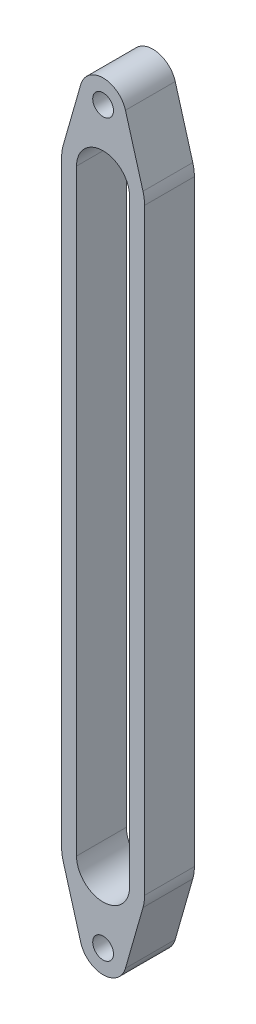
ISO-10303-21;
HEADER;
FILE_DESCRIPTION(('STEP AP214'),'2;1');
FILE_NAME('part.step','',(''),(''),'','','');
FILE_SCHEMA(('AUTOMOTIVE_DESIGN { 1 0 10303 214 1 1 1 1 }'));
ENDSEC;
DATA;
#1=APPLICATION_CONTEXT('core data for automotive mechanical design processes');
#2=APPLICATION_PROTOCOL_DEFINITION('international standard','automotive_design',2000,#1);
#3=PRODUCT_CONTEXT('',#1,'mechanical');
#4=PRODUCT('Part','Part','',(#3));
#5=PRODUCT_RELATED_PRODUCT_CATEGORY('part','',(#4));
#6=PRODUCT_DEFINITION_FORMATION('','',#4);
#7=PRODUCT_DEFINITION_CONTEXT('part definition',#1,'design');
#8=PRODUCT_DEFINITION('design','',#6,#7);
#9=PRODUCT_DEFINITION_SHAPE('','',#8);
#10=(LENGTH_UNIT() NAMED_UNIT(*) SI_UNIT(.MILLI.,.METRE.));
#11=(NAMED_UNIT(*) PLANE_ANGLE_UNIT() SI_UNIT($,.RADIAN.));
#12=(NAMED_UNIT(*) SI_UNIT($,.STERADIAN.) SOLID_ANGLE_UNIT());
#13=UNCERTAINTY_MEASURE_WITH_UNIT(LENGTH_MEASURE(1.E-05),#10,'distance_accuracy_value','');
#14=(GEOMETRIC_REPRESENTATION_CONTEXT(3) GLOBAL_UNCERTAINTY_ASSIGNED_CONTEXT((#13)) GLOBAL_UNIT_ASSIGNED_CONTEXT((#10,
#11,#12)) REPRESENTATION_CONTEXT('',''));
#15=CARTESIAN_POINT('',(0.,0.,0.));
#16=DIRECTION('',(0.,0.,1.));
#17=DIRECTION('',(1.,0.,0.));
#18=AXIS2_PLACEMENT_3D('',#15,#16,#17);
#19=CARTESIAN_POINT('',(753.020961901222,675.64,-26.9748));
#20=DIRECTION('',(0.,0.,1.));
#21=DIRECTION('',(1.,0.,0.));
#22=AXIS2_PLACEMENT_3D('',#19,#20,#21);
#23=CYLINDRICAL_SURFACE('',#22,31.75);
#24=CARTESIAN_POINT('',(753.020961901222,675.64,11.1252));
#25=DIRECTION('',(0.,0.,1.));
#26=DIRECTION('',(-1.,0.,0.));
#27=AXIS2_PLACEMENT_3D('',#24,#25,#26);
#28=CIRCLE('',#27,31.75);
#29=CARTESIAN_POINT('',(722.495107720913,684.37125,11.1252));
#30=VERTEX_POINT('',#29);
#31=CARTESIAN_POINT('',(721.270961901222,675.64,11.1252));
#32=VERTEX_POINT('',#31);
#33=EDGE_CURVE('E190',#30,#32,#28,.T.);
#34=ORIENTED_EDGE('',*,*,#33,.F.);
#35=DIRECTION('',(0.,0.,1.));
#36=VECTOR('',#35,1.);
#37=CARTESIAN_POINT('',(722.495107720913,684.37125,-26.9748));
#38=LINE('',#37,#36);
#39=CARTESIAN_POINT('',(722.495107720913,684.37125,-26.9748));
#40=VERTEX_POINT('',#39);
#41=EDGE_CURVE('E11',#40,#30,#38,.T.);
#42=ORIENTED_EDGE('',*,*,#41,.F.);
#43=CARTESIAN_POINT('',(753.020961901222,675.64,-26.9748));
#44=DIRECTION('',(0.,0.,1.));
#45=DIRECTION('',(-1.,0.,0.));
#46=AXIS2_PLACEMENT_3D('',#43,#44,#45);
#47=CIRCLE('',#46,31.75);
#48=CARTESIAN_POINT('',(721.270961901222,675.64,-26.9748));
#49=VERTEX_POINT('',#48);
#50=EDGE_CURVE('E193',#40,#49,#47,.T.);
#51=ORIENTED_EDGE('',*,*,#50,.T.);
#52=DIRECTION('',(0.,0.,1.));
#53=VECTOR('',#52,1.);
#54=CARTESIAN_POINT('',(721.270961901222,675.64,-26.9748));
#55=LINE('',#54,#53);
#56=EDGE_CURVE('E36',#49,#32,#55,.T.);
#57=ORIENTED_EDGE('',*,*,#56,.T.);
#58=EDGE_LOOP('',(#34,#42,#51,#57));
#59=FACE_BOUND('',#58,.T.);
#60=ADVANCED_FACE('F33',(#59),#23,.T.);
#61=CARTESIAN_POINT('',(735.926483560249,731.3295,-26.9748));
#62=DIRECTION('',(-0.96144422615147,0.275000000000001,0.));
#63=DIRECTION('',(-0.275000000000001,-0.961444226151471,0.));
#64=AXIS2_PLACEMENT_3D('',#61,#62,#63);
#65=PLANE('',#64);
#66=DIRECTION('',(-0.275000000000001,-0.96144422615147,0.));
#67=VECTOR('',#66,1.);
#68=CARTESIAN_POINT('',(735.926483560249,731.3295,11.1252));
#69=LINE('',#68,#67);
#70=CARTESIAN_POINT('',(735.926483560249,731.3295,11.1252));
#71=VERTEX_POINT('',#70);
#72=EDGE_CURVE('E197',#71,#30,#69,.T.);
#73=ORIENTED_EDGE('',*,*,#72,.F.);
#74=DIRECTION('',(0.,0.,1.));
#75=VECTOR('',#74,1.);
#76=CARTESIAN_POINT('',(735.926483560249,731.3295,-26.9748));
#77=LINE('',#76,#75);
#78=CARTESIAN_POINT('',(735.926483560249,731.3295,-26.9748));
#79=VERTEX_POINT('',#78);
#80=EDGE_CURVE('E41',#79,#71,#77,.T.);
#81=ORIENTED_EDGE('',*,*,#80,.F.);
#82=DIRECTION('',(-0.275000000000001,-0.96144422615147,0.));
#83=VECTOR('',#82,1.);
#84=CARTESIAN_POINT('',(735.926483560249,731.3295,-26.9748));
#85=LINE('',#84,#83);
#86=EDGE_CURVE('E227',#79,#40,#85,.T.);
#87=ORIENTED_EDGE('',*,*,#86,.T.);
#88=ORIENTED_EDGE('',*,*,#41,.T.);
#89=EDGE_LOOP('',(#73,#81,#87,#88));
#90=FACE_BOUND('',#89,.T.);
#91=ADVANCED_FACE('F294',(#90),#65,.T.);
#92=CARTESIAN_POINT('',(753.020961901222,726.44,-26.9748));
#93=DIRECTION('',(0.,0.,1.));
#94=DIRECTION('',(1.,0.,0.));
#95=AXIS2_PLACEMENT_3D('',#92,#93,#94);
#96=CYLINDRICAL_SURFACE('',#95,17.78);
#97=CARTESIAN_POINT('',(753.020961901222,726.44,11.1252));
#98=DIRECTION('',(0.,0.,1.));
#99=DIRECTION('',(1.,0.,0.));
#100=AXIS2_PLACEMENT_3D('',#97,#98,#99);
#101=CIRCLE('',#100,17.78);
#102=CARTESIAN_POINT('',(770.115440242195,731.3295,11.1252));
#103=VERTEX_POINT('',#102);
#104=EDGE_CURVE('E259',#103,#71,#101,.T.);
#105=ORIENTED_EDGE('',*,*,#104,.F.);
#106=DIRECTION('',(0.,0.,1.));
#107=VECTOR('',#106,1.);
#108=CARTESIAN_POINT('',(770.115440242195,731.3295,-26.9748));
#109=LINE('',#108,#107);
#110=CARTESIAN_POINT('',(770.115440242195,731.3295,-26.9748));
#111=VERTEX_POINT('',#110);
#112=EDGE_CURVE('E265',#111,#103,#109,.T.);
#113=ORIENTED_EDGE('',*,*,#112,.F.);
#114=CARTESIAN_POINT('',(753.020961901222,726.44,-26.9748));
#115=DIRECTION('',(0.,0.,1.));
#116=DIRECTION('',(1.,0.,0.));
#117=AXIS2_PLACEMENT_3D('',#114,#115,#116);
#118=CIRCLE('',#117,17.78);
#119=EDGE_CURVE('E224',#111,#79,#118,.T.);
#120=ORIENTED_EDGE('',*,*,#119,.T.);
#121=ORIENTED_EDGE('',*,*,#80,.T.);
#122=EDGE_LOOP('',(#105,#113,#120,#121));
#123=FACE_BOUND('',#122,.T.);
#124=ADVANCED_FACE('F330',(#123),#96,.T.);
#125=CARTESIAN_POINT('',(770.115440242195,731.3295,-26.9748));
#126=DIRECTION('',(0.961444226151471,0.274999999999998,0.));
#127=DIRECTION('',(-0.274999999999998,0.961444226151471,0.));
#128=AXIS2_PLACEMENT_3D('',#125,#126,#127);
#129=PLANE('',#128);
#130=DIRECTION('',(-0.274999999999998,0.961444226151471,0.));
#131=VECTOR('',#130,1.);
#132=CARTESIAN_POINT('',(770.115440242195,731.3295,11.1252));
#133=LINE('',#132,#131);
#134=CARTESIAN_POINT('',(783.546816081531,684.37125,11.1252));
#135=VERTEX_POINT('',#134);
#136=EDGE_CURVE('E256',#135,#103,#133,.T.);
#137=ORIENTED_EDGE('',*,*,#136,.F.);
#138=DIRECTION('',(0.,0.,1.));
#139=VECTOR('',#138,1.);
#140=CARTESIAN_POINT('',(783.546816081531,684.37125,-26.9748));
#141=LINE('',#140,#139);
#142=CARTESIAN_POINT('',(783.546816081531,684.37125,-26.9748));
#143=VERTEX_POINT('',#142);
#144=EDGE_CURVE('E267',#143,#135,#141,.T.);
#145=ORIENTED_EDGE('',*,*,#144,.F.);
#146=DIRECTION('',(-0.274999999999998,0.961444226151471,0.));
#147=VECTOR('',#146,1.);
#148=CARTESIAN_POINT('',(770.115440242195,731.3295,-26.9748));
#149=LINE('',#148,#147);
#150=EDGE_CURVE('E221',#143,#111,#149,.T.);
#151=ORIENTED_EDGE('',*,*,#150,.T.);
#152=ORIENTED_EDGE('',*,*,#112,.T.);
#153=EDGE_LOOP('',(#137,#145,#151,#152));
#154=FACE_BOUND('',#153,.T.);
#155=ADVANCED_FACE('F327',(#154),#129,.T.);
#156=CARTESIAN_POINT('',(753.020961901222,675.64,-26.9748));
#157=DIRECTION('',(0.,0.,1.));
#158=DIRECTION('',(1.,0.,0.));
#159=AXIS2_PLACEMENT_3D('',#156,#157,#158);
#160=CYLINDRICAL_SURFACE('',#159,31.75);
#161=CARTESIAN_POINT('',(753.020961901222,675.64,11.1252));
#162=DIRECTION('',(0.,0.,1.));
#163=DIRECTION('',(-1.,0.,0.));
#164=AXIS2_PLACEMENT_3D('',#161,#162,#163);
#165=CIRCLE('',#164,31.75);
#166=CARTESIAN_POINT('',(784.770961901222,675.64,11.1252));
#167=VERTEX_POINT('',#166);
#168=EDGE_CURVE('E253',#167,#135,#165,.T.);
#169=ORIENTED_EDGE('',*,*,#168,.F.);
#170=DIRECTION('',(0.,0.,1.));
#171=VECTOR('',#170,1.);
#172=CARTESIAN_POINT('',(784.770961901222,675.64,-26.9748));
#173=LINE('',#172,#171);
#174=CARTESIAN_POINT('',(784.770961901222,675.64,-26.9748));
#175=VERTEX_POINT('',#174);
#176=EDGE_CURVE('E269',#175,#167,#173,.T.);
#177=ORIENTED_EDGE('',*,*,#176,.F.);
#178=CARTESIAN_POINT('',(753.020961901222,675.64,-26.9748));
#179=DIRECTION('',(0.,0.,1.));
#180=DIRECTION('',(-1.,0.,0.));
#181=AXIS2_PLACEMENT_3D('',#178,#179,#180);
#182=CIRCLE('',#181,31.75);
#183=EDGE_CURVE('E218',#175,#143,#182,.T.);
#184=ORIENTED_EDGE('',*,*,#183,.T.);
#185=ORIENTED_EDGE('',*,*,#144,.T.);
#186=EDGE_LOOP('',(#169,#177,#184,#185));
#187=FACE_BOUND('',#186,.T.);
#188=ADVANCED_FACE('F324',(#187),#160,.T.);
#189=CARTESIAN_POINT('',(784.770961901222,675.64,-26.9748));
#190=DIRECTION('',(1.,0.,0.));
#191=DIRECTION('',(0.,0.,-1.));
#192=AXIS2_PLACEMENT_3D('',#189,#190,#191);
#193=PLANE('',#192);
#194=DIRECTION('',(0.,1.,0.));
#195=VECTOR('',#194,1.);
#196=CARTESIAN_POINT('',(784.770961901222,675.64,11.1252));
#197=LINE('',#196,#195);
#198=CARTESIAN_POINT('',(784.770961901222,218.44,11.1252));
#199=VERTEX_POINT('',#198);
#200=EDGE_CURVE('E250',#199,#167,#197,.T.);
#201=ORIENTED_EDGE('',*,*,#200,.F.);
#202=DIRECTION('',(0.,0.,1.));
#203=VECTOR('',#202,1.);
#204=CARTESIAN_POINT('',(784.770961901222,218.44,-26.9748));
#205=LINE('',#204,#203);
#206=CARTESIAN_POINT('',(784.770961901222,218.44,-26.9748));
#207=VERTEX_POINT('',#206);
#208=EDGE_CURVE('E271',#207,#199,#205,.T.);
#209=ORIENTED_EDGE('',*,*,#208,.F.);
#210=DIRECTION('',(0.,1.,0.));
#211=VECTOR('',#210,1.);
#212=CARTESIAN_POINT('',(784.770961901222,675.64,-26.9748));
#213=LINE('',#212,#211);
#214=EDGE_CURVE('E215',#207,#175,#213,.T.);
#215=ORIENTED_EDGE('',*,*,#214,.T.);
#216=ORIENTED_EDGE('',*,*,#176,.T.);
#217=EDGE_LOOP('',(#201,#209,#215,#216));
#218=FACE_BOUND('',#217,.T.);
#219=ADVANCED_FACE('F320',(#218),#193,.T.);
#220=CARTESIAN_POINT('',(753.020961901222,218.44,-26.9748));
#221=DIRECTION('',(0.,0.,1.));
#222=DIRECTION('',(1.,0.,0.));
#223=AXIS2_PLACEMENT_3D('',#220,#221,#222);
#224=CYLINDRICAL_SURFACE('',#223,31.7499999999993);
#225=CARTESIAN_POINT('',(753.020961901222,218.44,11.1252));
#226=DIRECTION('',(0.,0.,1.));
#227=DIRECTION('',(1.,0.,0.));
#228=AXIS2_PLACEMENT_3D('',#225,#226,#227);
#229=CIRCLE('',#228,31.7499999999993);
#230=CARTESIAN_POINT('',(783.546816081531,209.70875,11.1252));
#231=VERTEX_POINT('',#230);
#232=EDGE_CURVE('E247',#231,#199,#229,.T.);
#233=ORIENTED_EDGE('',*,*,#232,.F.);
#234=DIRECTION('',(0.,0.,1.));
#235=VECTOR('',#234,1.);
#236=CARTESIAN_POINT('',(783.546816081531,209.70875,-26.9748));
#237=LINE('',#236,#235);
#238=CARTESIAN_POINT('',(783.546816081531,209.70875,-26.9748));
#239=VERTEX_POINT('',#238);
#240=EDGE_CURVE('E273',#239,#231,#237,.T.);
#241=ORIENTED_EDGE('',*,*,#240,.F.);
#242=CARTESIAN_POINT('',(753.020961901222,218.44,-26.9748));
#243=DIRECTION('',(0.,0.,1.));
#244=DIRECTION('',(1.,0.,0.));
#245=AXIS2_PLACEMENT_3D('',#242,#243,#244);
#246=CIRCLE('',#245,31.7499999999993);
#247=EDGE_CURVE('E212',#239,#207,#246,.T.);
#248=ORIENTED_EDGE('',*,*,#247,.T.);
#249=ORIENTED_EDGE('',*,*,#208,.T.);
#250=EDGE_LOOP('',(#233,#241,#248,#249));
#251=FACE_BOUND('',#250,.T.);
#252=ADVANCED_FACE('F316',(#251),#224,.T.);
#253=CARTESIAN_POINT('',(770.115440242195,162.7505,-26.9748));
#254=DIRECTION('',(0.961444226151471,-0.274999999999999,0.));
#255=DIRECTION('',(0.274999999999999,0.961444226151471,0.));
#256=AXIS2_PLACEMENT_3D('',#253,#254,#255);
#257=PLANE('',#256);
#258=DIRECTION('',(0.274999999999999,0.961444226151471,0.));
#259=VECTOR('',#258,1.);
#260=CARTESIAN_POINT('',(770.115440242195,162.7505,11.1252));
#261=LINE('',#260,#259);
#262=CARTESIAN_POINT('',(770.115440242196,162.7505,11.1252));
#263=VERTEX_POINT('',#262);
#264=EDGE_CURVE('E244',#263,#231,#261,.T.);
#265=ORIENTED_EDGE('',*,*,#264,.F.);
#266=DIRECTION('',(0.,0.,1.));
#267=VECTOR('',#266,1.);
#268=CARTESIAN_POINT('',(770.115440242196,162.7505,-26.9748));
#269=LINE('',#268,#267);
#270=CARTESIAN_POINT('',(770.115440242196,162.7505,-26.9748));
#271=VERTEX_POINT('',#270);
#272=EDGE_CURVE('E275',#271,#263,#269,.T.);
#273=ORIENTED_EDGE('',*,*,#272,.F.);
#274=DIRECTION('',(0.274999999999999,0.961444226151471,0.));
#275=VECTOR('',#274,1.);
#276=CARTESIAN_POINT('',(770.115440242195,162.7505,-26.9748));
#277=LINE('',#276,#275);
#278=EDGE_CURVE('E209',#271,#239,#277,.T.);
#279=ORIENTED_EDGE('',*,*,#278,.T.);
#280=ORIENTED_EDGE('',*,*,#240,.T.);
#281=EDGE_LOOP('',(#265,#273,#279,#280));
#282=FACE_BOUND('',#281,.T.);
#283=ADVANCED_FACE('F312',(#282),#257,.T.);
#284=CARTESIAN_POINT('',(753.020961901222,167.64,-26.9748));
#285=DIRECTION('',(0.,0.,1.));
#286=DIRECTION('',(1.,0.,0.));
#287=AXIS2_PLACEMENT_3D('',#284,#285,#286);
#288=CYLINDRICAL_SURFACE('',#287,17.78);
#289=CARTESIAN_POINT('',(753.020961901222,167.64,11.1252));
#290=DIRECTION('',(0.,0.,1.));
#291=DIRECTION('',(-1.,0.,0.));
#292=AXIS2_PLACEMENT_3D('',#289,#290,#291);
#293=CIRCLE('',#292,17.78);
#294=CARTESIAN_POINT('',(735.926483560249,162.7505,11.1252));
#295=VERTEX_POINT('',#294);
#296=EDGE_CURVE('E241',#295,#263,#293,.T.);
#297=ORIENTED_EDGE('',*,*,#296,.F.);
#298=DIRECTION('',(0.,0.,1.));
#299=VECTOR('',#298,1.);
#300=CARTESIAN_POINT('',(735.926483560249,162.7505,-26.9748));
#301=LINE('',#300,#299);
#302=CARTESIAN_POINT('',(735.926483560249,162.7505,-26.9748));
#303=VERTEX_POINT('',#302);
#304=EDGE_CURVE('E277',#303,#295,#301,.T.);
#305=ORIENTED_EDGE('',*,*,#304,.F.);
#306=CARTESIAN_POINT('',(753.020961901222,167.64,-26.9748));
#307=DIRECTION('',(0.,0.,1.));
#308=DIRECTION('',(-1.,0.,0.));
#309=AXIS2_PLACEMENT_3D('',#306,#307,#308);
#310=CIRCLE('',#309,17.78);
#311=EDGE_CURVE('E206',#303,#271,#310,.T.);
#312=ORIENTED_EDGE('',*,*,#311,.T.);
#313=ORIENTED_EDGE('',*,*,#272,.T.);
#314=EDGE_LOOP('',(#297,#305,#312,#313));
#315=FACE_BOUND('',#314,.T.);
#316=ADVANCED_FACE('F308',(#315),#288,.T.);
#317=CARTESIAN_POINT('',(735.926483560249,162.7505,-26.9748));
#318=DIRECTION('',(-0.96144422615147,-0.275000000000002,0.));
#319=DIRECTION('',(0.275000000000002,-0.96144422615147,0.));
#320=AXIS2_PLACEMENT_3D('',#317,#318,#319);
#321=PLANE('',#320);
#322=DIRECTION('',(0.275000000000001,-0.96144422615147,0.));
#323=VECTOR('',#322,1.);
#324=CARTESIAN_POINT('',(735.926483560249,162.7505,11.1252));
#325=LINE('',#324,#323);
#326=CARTESIAN_POINT('',(722.495107720913,209.70875,11.1252));
#327=VERTEX_POINT('',#326);
#328=EDGE_CURVE('E238',#327,#295,#325,.T.);
#329=ORIENTED_EDGE('',*,*,#328,.F.);
#330=DIRECTION('',(0.,0.,1.));
#331=VECTOR('',#330,1.);
#332=CARTESIAN_POINT('',(722.495107720913,209.70875,-26.9748));
#333=LINE('',#332,#331);
#334=CARTESIAN_POINT('',(722.495107720913,209.70875,-26.9748));
#335=VERTEX_POINT('',#334);
#336=EDGE_CURVE('E279',#335,#327,#333,.T.);
#337=ORIENTED_EDGE('',*,*,#336,.F.);
#338=DIRECTION('',(0.275000000000001,-0.96144422615147,0.));
#339=VECTOR('',#338,1.);
#340=CARTESIAN_POINT('',(735.926483560249,162.7505,-26.9748));
#341=LINE('',#340,#339);
#342=EDGE_CURVE('E203',#335,#303,#341,.T.);
#343=ORIENTED_EDGE('',*,*,#342,.T.);
#344=ORIENTED_EDGE('',*,*,#304,.T.);
#345=EDGE_LOOP('',(#329,#337,#343,#344));
#346=FACE_BOUND('',#345,.T.);
#347=ADVANCED_FACE('F306',(#346),#321,.T.);
#348=CARTESIAN_POINT('',(753.020961901222,218.44,-26.9748));
#349=DIRECTION('',(0.,0.,1.));
#350=DIRECTION('',(1.,0.,0.));
#351=AXIS2_PLACEMENT_3D('',#348,#349,#350);
#352=CYLINDRICAL_SURFACE('',#351,31.7500000000006);
#353=CARTESIAN_POINT('',(753.020961901222,218.44,11.1252));
#354=DIRECTION('',(0.,0.,1.));
#355=DIRECTION('',(1.,0.,0.));
#356=AXIS2_PLACEMENT_3D('',#353,#354,#355);
#357=CIRCLE('',#356,31.7500000000006);
#358=CARTESIAN_POINT('',(721.270961901222,218.44,11.1252));
#359=VERTEX_POINT('',#358);
#360=EDGE_CURVE('E235',#359,#327,#357,.T.);
#361=ORIENTED_EDGE('',*,*,#360,.F.);
#362=DIRECTION('',(0.,0.,1.));
#363=VECTOR('',#362,1.);
#364=CARTESIAN_POINT('',(721.270961901222,218.44,-26.9748));
#365=LINE('',#364,#363);
#366=CARTESIAN_POINT('',(721.270961901222,218.44,-26.9748));
#367=VERTEX_POINT('',#366);
#368=EDGE_CURVE('E280',#367,#359,#365,.T.);
#369=ORIENTED_EDGE('',*,*,#368,.F.);
#370=CARTESIAN_POINT('',(753.020961901222,218.44,-26.9748));
#371=DIRECTION('',(0.,0.,1.));
#372=DIRECTION('',(1.,0.,0.));
#373=AXIS2_PLACEMENT_3D('',#370,#371,#372);
#374=CIRCLE('',#373,31.7500000000006);
#375=EDGE_CURVE('E200',#367,#335,#374,.T.);
#376=ORIENTED_EDGE('',*,*,#375,.T.);
#377=ORIENTED_EDGE('',*,*,#336,.T.);
#378=EDGE_LOOP('',(#361,#369,#376,#377));
#379=FACE_BOUND('',#378,.T.);
#380=ADVANCED_FACE('F302',(#379),#352,.T.);
#381=CARTESIAN_POINT('',(721.270961901222,675.64,-26.9748));
#382=DIRECTION('',(-1.,0.,0.));
#383=DIRECTION('',(0.,0.,1.));
#384=AXIS2_PLACEMENT_3D('',#381,#382,#383);
#385=PLANE('',#384);
#386=DIRECTION('',(0.,-1.,0.));
#387=VECTOR('',#386,1.);
#388=CARTESIAN_POINT('',(721.270961901222,675.64,11.1252));
#389=LINE('',#388,#387);
#390=EDGE_CURVE('E232',#32,#359,#389,.T.);
#391=ORIENTED_EDGE('',*,*,#390,.F.);
#392=ORIENTED_EDGE('',*,*,#56,.F.);
#393=DIRECTION('',(0.,-1.,0.));
#394=VECTOR('',#393,1.);
#395=CARTESIAN_POINT('',(721.270961901222,675.64,-26.9748));
#396=LINE('',#395,#394);
#397=EDGE_CURVE('E196',#49,#367,#396,.T.);
#398=ORIENTED_EDGE('',*,*,#397,.T.);
#399=ORIENTED_EDGE('',*,*,#368,.T.);
#400=EDGE_LOOP('',(#391,#392,#398,#399));
#401=FACE_BOUND('',#400,.T.);
#402=ADVANCED_FACE('F288',(#401),#385,.T.);
#403=CARTESIAN_POINT('',(753.020961901222,675.64,-26.9748));
#404=DIRECTION('',(0.,0.,-1.));
#405=DIRECTION('',(-1.,0.,0.));
#406=AXIS2_PLACEMENT_3D('',#403,#404,#405);
#407=PLANE('',#406);
#408=CARTESIAN_POINT('',(753.020961901222,167.64,-26.9748));
#409=DIRECTION('',(0.,0.,1.));
#410=DIRECTION('',(1.,0.,0.));
#411=AXIS2_PLACEMENT_3D('',#408,#409,#410);
#412=CIRCLE('',#411,7.9375000000001);
#413=CARTESIAN_POINT('',(760.958461901223,167.64,-26.9748));
#414=VERTEX_POINT('',#413);
#415=EDGE_CURVE('E177',#414,#414,#412,.T.);
#416=ORIENTED_EDGE('',*,*,#415,.T.);
#417=EDGE_LOOP('',(#416));
#418=FACE_BOUND('',#417,.T.);
#419=CARTESIAN_POINT('',(753.020961901222,675.64,-26.9748));
#420=DIRECTION('',(0.,0.,1.));
#421=DIRECTION('',(-1.,0.,0.));
#422=AXIS2_PLACEMENT_3D('',#419,#420,#421);
#423=CIRCLE('',#422,20.32);
#424=CARTESIAN_POINT('',(773.340961901222,675.64,-26.9748));
#425=VERTEX_POINT('',#424);
#426=CARTESIAN_POINT('',(732.700961901222,675.64,-26.9748));
#427=VERTEX_POINT('',#426);
#428=EDGE_CURVE('E148',#425,#427,#423,.T.);
#429=ORIENTED_EDGE('',*,*,#428,.T.);
#430=DIRECTION('',(0.,-1.,0.));
#431=VECTOR('',#430,1.);
#432=CARTESIAN_POINT('',(732.700961901222,675.64,-26.9748));
#433=LINE('',#432,#431);
#434=CARTESIAN_POINT('',(732.700961901222,218.44,-26.9748));
#435=VERTEX_POINT('',#434);
#436=EDGE_CURVE('E157',#427,#435,#433,.T.);
#437=ORIENTED_EDGE('',*,*,#436,.T.);
#438=CARTESIAN_POINT('',(753.020961901222,218.44,-26.9748));
#439=DIRECTION('',(0.,0.,1.));
#440=DIRECTION('',(1.,0.,0.));
#441=AXIS2_PLACEMENT_3D('',#438,#439,#440);
#442=CIRCLE('',#441,20.32);
#443=CARTESIAN_POINT('',(773.340961901222,218.44,-26.9748));
#444=VERTEX_POINT('',#443);
#445=EDGE_CURVE('E49',#435,#444,#442,.T.);
#446=ORIENTED_EDGE('',*,*,#445,.T.);
#447=DIRECTION('',(0.,1.,0.));
#448=VECTOR('',#447,1.);
#449=CARTESIAN_POINT('',(773.340961901222,218.44,-26.9748));
#450=LINE('',#449,#448);
#451=EDGE_CURVE('E154',#444,#425,#450,.T.);
#452=ORIENTED_EDGE('',*,*,#451,.T.);
#453=EDGE_LOOP('',(#429,#437,#446,#452));
#454=FACE_BOUND('',#453,.T.);
#455=CARTESIAN_POINT('',(753.020961901222,726.44,-26.9748));
#456=DIRECTION('',(0.,0.,1.));
#457=DIRECTION('',(1.,0.,0.));
#458=AXIS2_PLACEMENT_3D('',#455,#456,#457);
#459=CIRCLE('',#458,7.9375000000001);
#460=CARTESIAN_POINT('',(760.958461901222,726.44,-26.9748));
#461=VERTEX_POINT('',#460);
#462=EDGE_CURVE('E187',#461,#461,#459,.T.);
#463=ORIENTED_EDGE('',*,*,#462,.T.);
#464=EDGE_LOOP('',(#463));
#465=FACE_BOUND('',#464,.T.);
#466=ORIENTED_EDGE('',*,*,#50,.F.);
#467=ORIENTED_EDGE('',*,*,#86,.F.);
#468=ORIENTED_EDGE('',*,*,#119,.F.);
#469=ORIENTED_EDGE('',*,*,#150,.F.);
#470=ORIENTED_EDGE('',*,*,#183,.F.);
#471=ORIENTED_EDGE('',*,*,#214,.F.);
#472=ORIENTED_EDGE('',*,*,#247,.F.);
#473=ORIENTED_EDGE('',*,*,#278,.F.);
#474=ORIENTED_EDGE('',*,*,#311,.F.);
#475=ORIENTED_EDGE('',*,*,#342,.F.);
#476=ORIENTED_EDGE('',*,*,#375,.F.);
#477=ORIENTED_EDGE('',*,*,#397,.F.);
#478=EDGE_LOOP('',(#466,#467,#468,#469,#470,#471,#472,#473,#474,#475,#476,#477));
#479=FACE_BOUND('',#478,.T.);
#480=ADVANCED_FACE('F161',(#418,#454,#465,#479),#407,.T.);
#481=CARTESIAN_POINT('',(753.020961901222,675.64,11.1252));
#482=DIRECTION('',(0.,0.,-1.));
#483=DIRECTION('',(-1.,0.,0.));
#484=AXIS2_PLACEMENT_3D('',#481,#482,#483);
#485=PLANE('',#484);
#486=CARTESIAN_POINT('',(753.020961901222,167.64,11.1252));
#487=DIRECTION('',(0.,0.,1.));
#488=DIRECTION('',(1.,0.,0.));
#489=AXIS2_PLACEMENT_3D('',#486,#487,#488);
#490=CIRCLE('',#489,7.9375000000001);
#491=CARTESIAN_POINT('',(760.958461901223,167.64,11.1252));
#492=VERTEX_POINT('',#491);
#493=EDGE_CURVE('E170',#492,#492,#490,.T.);
#494=ORIENTED_EDGE('',*,*,#493,.F.);
#495=EDGE_LOOP('',(#494));
#496=FACE_BOUND('',#495,.T.);
#497=DIRECTION('',(0.,-1.,0.));
#498=VECTOR('',#497,1.);
#499=CARTESIAN_POINT('',(732.700961901222,675.64,11.1252));
#500=LINE('',#499,#498);
#501=CARTESIAN_POINT('',(732.700961901222,675.64,11.1252));
#502=VERTEX_POINT('',#501);
#503=CARTESIAN_POINT('',(732.700961901222,218.44,11.1252));
#504=VERTEX_POINT('',#503);
#505=EDGE_CURVE('E176',#502,#504,#500,.T.);
#506=ORIENTED_EDGE('',*,*,#505,.F.);
#507=CARTESIAN_POINT('',(753.020961901222,675.64,11.1252));
#508=DIRECTION('',(0.,0.,1.));
#509=DIRECTION('',(-1.,0.,0.));
#510=AXIS2_PLACEMENT_3D('',#507,#508,#509);
#511=CIRCLE('',#510,20.32);
#512=CARTESIAN_POINT('',(773.340961901222,675.64,11.1252));
#513=VERTEX_POINT('',#512);
#514=EDGE_CURVE('E57',#513,#502,#511,.T.);
#515=ORIENTED_EDGE('',*,*,#514,.F.);
#516=DIRECTION('',(0.,1.,0.));
#517=VECTOR('',#516,1.);
#518=CARTESIAN_POINT('',(773.340961901222,218.44,11.1252));
#519=LINE('',#518,#517);
#520=CARTESIAN_POINT('',(773.340961901222,218.44,11.1252));
#521=VERTEX_POINT('',#520);
#522=EDGE_CURVE('E164',#521,#513,#519,.T.);
#523=ORIENTED_EDGE('',*,*,#522,.F.);
#524=CARTESIAN_POINT('',(753.020961901222,218.44,11.1252));
#525=DIRECTION('',(0.,0.,1.));
#526=DIRECTION('',(1.,0.,0.));
#527=AXIS2_PLACEMENT_3D('',#524,#525,#526);
#528=CIRCLE('',#527,20.32);
#529=EDGE_CURVE('E167',#504,#521,#528,.T.);
#530=ORIENTED_EDGE('',*,*,#529,.F.);
#531=EDGE_LOOP('',(#506,#515,#523,#530));
#532=FACE_BOUND('',#531,.T.);
#533=CARTESIAN_POINT('',(753.020961901222,726.44,11.1252));
#534=DIRECTION('',(0.,0.,1.));
#535=DIRECTION('',(1.,0.,0.));
#536=AXIS2_PLACEMENT_3D('',#533,#534,#535);
#537=CIRCLE('',#536,7.9375000000001);
#538=CARTESIAN_POINT('',(760.958461901222,726.44,11.1252));
#539=VERTEX_POINT('',#538);
#540=EDGE_CURVE('E183',#539,#539,#537,.T.);
#541=ORIENTED_EDGE('',*,*,#540,.F.);
#542=EDGE_LOOP('',(#541));
#543=FACE_BOUND('',#542,.T.);
#544=ORIENTED_EDGE('',*,*,#33,.T.);
#545=ORIENTED_EDGE('',*,*,#390,.T.);
#546=ORIENTED_EDGE('',*,*,#360,.T.);
#547=ORIENTED_EDGE('',*,*,#328,.T.);
#548=ORIENTED_EDGE('',*,*,#296,.T.);
#549=ORIENTED_EDGE('',*,*,#264,.T.);
#550=ORIENTED_EDGE('',*,*,#232,.T.);
#551=ORIENTED_EDGE('',*,*,#200,.T.);
#552=ORIENTED_EDGE('',*,*,#168,.T.);
#553=ORIENTED_EDGE('',*,*,#136,.T.);
#554=ORIENTED_EDGE('',*,*,#104,.T.);
#555=ORIENTED_EDGE('',*,*,#72,.T.);
#556=EDGE_LOOP('',(#544,#545,#546,#547,#548,#549,#550,#551,#552,#553,#554,#555));
#557=FACE_BOUND('',#556,.T.);
#558=ADVANCED_FACE('F290',(#496,#532,#543,#557),#485,.F.);
#559=CARTESIAN_POINT('',(753.020961901222,726.44,-26.9748));
#560=DIRECTION('',(0.,0.,1.));
#561=DIRECTION('',(1.,0.,0.));
#562=AXIS2_PLACEMENT_3D('',#559,#560,#561);
#563=CYLINDRICAL_SURFACE('',#562,7.9375000000001);
#564=CARTESIAN_POINT('',(760.958461901222,726.44,-26.9748));
#565=CARTESIAN_POINT('',(760.958461901222,726.44,-26.577925));
#566=CARTESIAN_POINT('',(760.958461901222,726.44,-26.18105));
#567=CARTESIAN_POINT('',(760.958461901222,726.44,-25.3873));
#568=CARTESIAN_POINT('',(760.958461901222,726.44,-24.990425));
#569=CARTESIAN_POINT('',(760.958461901222,726.44,-24.196675));
#570=CARTESIAN_POINT('',(760.958461901222,726.44,-23.7998));
#571=CARTESIAN_POINT('',(760.958461901222,726.44,-23.00605));
#572=CARTESIAN_POINT('',(760.958461901222,726.44,-22.609175));
#573=CARTESIAN_POINT('',(760.958461901222,726.44,-21.815425));
#574=CARTESIAN_POINT('',(760.958461901222,726.44,-21.41855));
#575=CARTESIAN_POINT('',(760.958461901222,726.44,-20.6248));
#576=CARTESIAN_POINT('',(760.958461901222,726.44,-20.227925));
#577=CARTESIAN_POINT('',(760.958461901222,726.44,-19.434175));
#578=CARTESIAN_POINT('',(760.958461901222,726.44,-19.0373));
#579=CARTESIAN_POINT('',(760.958461901222,726.44,-18.24355));
#580=CARTESIAN_POINT('',(760.958461901222,726.44,-17.846675));
#581=CARTESIAN_POINT('',(760.958461901222,726.44,-17.052925));
#582=CARTESIAN_POINT('',(760.958461901222,726.44,-16.65605));
#583=CARTESIAN_POINT('',(760.958461901222,726.44,-15.8623));
#584=CARTESIAN_POINT('',(760.958461901222,726.44,-15.465425));
#585=CARTESIAN_POINT('',(760.958461901222,726.44,-14.671675));
#586=CARTESIAN_POINT('',(760.958461901222,726.44,-14.2748));
#587=CARTESIAN_POINT('',(760.958461901222,726.44,-13.48105));
#588=CARTESIAN_POINT('',(760.958461901222,726.44,-13.084175));
#589=CARTESIAN_POINT('',(760.958461901222,726.44,-12.290425));
#590=CARTESIAN_POINT('',(760.958461901222,726.44,-11.89355));
#591=CARTESIAN_POINT('',(760.958461901222,726.44,-11.0998));
#592=CARTESIAN_POINT('',(760.958461901222,726.44,-10.702925));
#593=CARTESIAN_POINT('',(760.958461901222,726.44,-9.909175));
#594=CARTESIAN_POINT('',(760.958461901222,726.44,-9.5123));
#595=CARTESIAN_POINT('',(760.958461901222,726.44,-8.71855));
#596=CARTESIAN_POINT('',(760.958461901222,726.44,-8.321675));
#597=CARTESIAN_POINT('',(760.958461901222,726.44,-7.527925));
#598=CARTESIAN_POINT('',(760.958461901222,726.44,-7.13105));
#599=CARTESIAN_POINT('',(760.958461901222,726.44,-6.3373));
#600=CARTESIAN_POINT('',(760.958461901222,726.44,-5.940425));
#601=CARTESIAN_POINT('',(760.958461901222,726.44,-5.146675));
#602=CARTESIAN_POINT('',(760.958461901222,726.44,-4.7498));
#603=CARTESIAN_POINT('',(760.958461901222,726.44,-3.95605));
#604=CARTESIAN_POINT('',(760.958461901222,726.44,-3.559175));
#605=CARTESIAN_POINT('',(760.958461901222,726.44,-2.765425));
#606=CARTESIAN_POINT('',(760.958461901222,726.44,-2.36855));
#607=CARTESIAN_POINT('',(760.958461901222,726.44,-1.5748));
#608=CARTESIAN_POINT('',(760.958461901222,726.44,-1.177925));
#609=CARTESIAN_POINT('',(760.958461901222,726.44,-0.384174999999998));
#610=CARTESIAN_POINT('',(760.958461901222,726.44,0.012700000000002));
#611=CARTESIAN_POINT('',(760.958461901222,726.44,0.806450000000003));
#612=CARTESIAN_POINT('',(760.958461901222,726.44,1.203325));
#613=CARTESIAN_POINT('',(760.958461901222,726.44,1.997075));
#614=CARTESIAN_POINT('',(760.958461901222,726.44,2.39395));
#615=CARTESIAN_POINT('',(760.958461901222,726.44,3.1877));
#616=CARTESIAN_POINT('',(760.958461901222,726.44,3.584575));
#617=CARTESIAN_POINT('',(760.958461901222,726.44,4.378325));
#618=CARTESIAN_POINT('',(760.958461901222,726.44,4.7752));
#619=CARTESIAN_POINT('',(760.958461901222,726.44,5.56895));
#620=CARTESIAN_POINT('',(760.958461901222,726.44,5.965825));
#621=CARTESIAN_POINT('',(760.958461901222,726.44,6.759575));
#622=CARTESIAN_POINT('',(760.958461901222,726.44,7.15645));
#623=CARTESIAN_POINT('',(760.958461901222,726.44,7.9502));
#624=CARTESIAN_POINT('',(760.958461901222,726.44,8.347075));
#625=CARTESIAN_POINT('',(760.958461901222,726.44,9.140825));
#626=CARTESIAN_POINT('',(760.958461901222,726.44,9.5377));
#627=CARTESIAN_POINT('',(760.958461901222,726.44,10.33145));
#628=CARTESIAN_POINT('',(760.958461901222,726.44,10.728325));
#629=CARTESIAN_POINT('',(760.958461901222,726.44,11.1252));
#630=B_SPLINE_CURVE_WITH_KNOTS('',3,(#564,#565,#566,#567,#568,#569,#570,#571,#572,#573,#574,
#575,#576,#577,#578,#579,#580,#581,#582,#583,#584,#585,#586,#587,#588,#589,#590,#591,#592,#593,
#594,#595,#596,#597,#598,#599,#600,#601,#602,#603,#604,#605,#606,#607,#608,#609,#610,#611,#612,
#613,#614,#615,#616,#617,#618,#619,#620,#621,#622,#623,#624,#625,#626,#627,#628,#629),
.UNSPECIFIED.,.F.,.F.,(4,2,2,2,2,2,2,2,2,2,2,2,2,2,2,2,2,2,2,2,2,2,2,2,2,2,2,2,2,2,2,2,4),(0.,
1.190625,2.38125,3.571875,4.7625,5.953125,7.14375,8.334375,9.525,10.715625,11.90625,13.096875,
14.2875,15.478125,16.66875,17.859375,19.05,20.240625,21.43125,22.621875,23.8125,25.003125,
26.19375,27.384375,28.575,29.765625,30.95625,32.146875,33.3375,34.528125,35.71875,36.909375,
38.1),.UNSPECIFIED.);
#631=EDGE_CURVE('BSEAM437',#461,#539,#630,.T.);
#632=ORIENTED_EDGE('',*,*,#462,.F.);
#633=ORIENTED_EDGE('',*,*,#540,.T.);
#634=ORIENTED_EDGE('',*,*,#631,.T.);
#635=ORIENTED_EDGE('',*,*,#631,.F.);
#636=EDGE_LOOP('',(#632,#634,#633,#635));
#637=FACE_BOUND('',#636,.T.);
#638=ADVANCED_FACE('F437',(#637),#563,.F.);
#639=CARTESIAN_POINT('',(753.020961901222,675.64,-26.9748));
#640=DIRECTION('',(0.,0.,1.));
#641=DIRECTION('',(1.,0.,0.));
#642=AXIS2_PLACEMENT_3D('',#639,#640,#641);
#643=CYLINDRICAL_SURFACE('',#642,20.32);
#644=ORIENTED_EDGE('',*,*,#514,.T.);
#645=DIRECTION('',(0.,0.,1.));
#646=VECTOR('',#645,1.);
#647=CARTESIAN_POINT('',(732.700961901222,675.64,-26.9748));
#648=LINE('',#647,#646);
#649=EDGE_CURVE('E144',#427,#502,#648,.T.);
#650=ORIENTED_EDGE('',*,*,#649,.F.);
#651=ORIENTED_EDGE('',*,*,#428,.F.);
#652=DIRECTION('',(0.,0.,1.));
#653=VECTOR('',#652,1.);
#654=CARTESIAN_POINT('',(773.340961901222,675.64,-26.9748));
#655=LINE('',#654,#653);
#656=EDGE_CURVE('E181',#425,#513,#655,.T.);
#657=ORIENTED_EDGE('',*,*,#656,.T.);
#658=EDGE_LOOP('',(#644,#650,#651,#657));
#659=FACE_BOUND('',#658,.T.);
#660=ADVANCED_FACE('F146',(#659),#643,.F.);
#661=CARTESIAN_POINT('',(773.340961901222,218.44,-26.9748));
#662=DIRECTION('',(1.,0.,0.));
#663=DIRECTION('',(0.,0.,-1.));
#664=AXIS2_PLACEMENT_3D('',#661,#662,#663);
#665=PLANE('',#664);
#666=ORIENTED_EDGE('',*,*,#522,.T.);
#667=ORIENTED_EDGE('',*,*,#656,.F.);
#668=ORIENTED_EDGE('',*,*,#451,.F.);
#669=DIRECTION('',(0.,0.,1.));
#670=VECTOR('',#669,1.);
#671=CARTESIAN_POINT('',(773.340961901222,218.44,-26.9748));
#672=LINE('',#671,#670);
#673=EDGE_CURVE('E184',#444,#521,#672,.T.);
#674=ORIENTED_EDGE('',*,*,#673,.T.);
#675=EDGE_LOOP('',(#666,#667,#668,#674));
#676=FACE_BOUND('',#675,.T.);
#677=ADVANCED_FACE('F456',(#676),#665,.F.);
#678=CARTESIAN_POINT('',(753.020961901222,218.44,-26.9748));
#679=DIRECTION('',(0.,0.,1.));
#680=DIRECTION('',(1.,0.,0.));
#681=AXIS2_PLACEMENT_3D('',#678,#679,#680);
#682=CYLINDRICAL_SURFACE('',#681,20.32);
#683=ORIENTED_EDGE('',*,*,#529,.T.);
#684=ORIENTED_EDGE('',*,*,#673,.F.);
#685=ORIENTED_EDGE('',*,*,#445,.F.);
#686=DIRECTION('',(0.,0.,1.));
#687=VECTOR('',#686,1.);
#688=CARTESIAN_POINT('',(732.700961901222,218.44,-26.9748));
#689=LINE('',#688,#687);
#690=EDGE_CURVE('E153',#435,#504,#689,.T.);
#691=ORIENTED_EDGE('',*,*,#690,.T.);
#692=EDGE_LOOP('',(#683,#684,#685,#691));
#693=FACE_BOUND('',#692,.T.);
#694=ADVANCED_FACE('F465',(#693),#682,.F.);
#695=CARTESIAN_POINT('',(732.700961901222,675.64,-26.9748));
#696=DIRECTION('',(-1.,0.,0.));
#697=DIRECTION('',(0.,0.,1.));
#698=AXIS2_PLACEMENT_3D('',#695,#696,#697);
#699=PLANE('',#698);
#700=ORIENTED_EDGE('',*,*,#505,.T.);
#701=ORIENTED_EDGE('',*,*,#690,.F.);
#702=ORIENTED_EDGE('',*,*,#436,.F.);
#703=ORIENTED_EDGE('',*,*,#649,.T.);
#704=EDGE_LOOP('',(#700,#701,#702,#703));
#705=FACE_BOUND('',#704,.T.);
#706=ADVANCED_FACE('F158',(#705),#699,.F.);
#707=CARTESIAN_POINT('',(753.020961901222,167.64,-26.9748));
#708=DIRECTION('',(0.,0.,1.));
#709=DIRECTION('',(1.,0.,0.));
#710=AXIS2_PLACEMENT_3D('',#707,#708,#709);
#711=CYLINDRICAL_SURFACE('',#710,7.9375000000001);
#712=CARTESIAN_POINT('',(760.958461901223,167.64,-26.9748));
#713=CARTESIAN_POINT('',(760.958461901223,167.64,-26.577925));
#714=CARTESIAN_POINT('',(760.958461901223,167.64,-26.18105));
#715=CARTESIAN_POINT('',(760.958461901223,167.64,-25.3873));
#716=CARTESIAN_POINT('',(760.958461901223,167.64,-24.990425));
#717=CARTESIAN_POINT('',(760.958461901223,167.64,-24.196675));
#718=CARTESIAN_POINT('',(760.958461901223,167.64,-23.7998));
#719=CARTESIAN_POINT('',(760.958461901223,167.64,-23.00605));
#720=CARTESIAN_POINT('',(760.958461901223,167.64,-22.609175));
#721=CARTESIAN_POINT('',(760.958461901223,167.64,-21.815425));
#722=CARTESIAN_POINT('',(760.958461901223,167.64,-21.41855));
#723=CARTESIAN_POINT('',(760.958461901223,167.64,-20.6248));
#724=CARTESIAN_POINT('',(760.958461901223,167.64,-20.227925));
#725=CARTESIAN_POINT('',(760.958461901223,167.64,-19.434175));
#726=CARTESIAN_POINT('',(760.958461901223,167.64,-19.0373));
#727=CARTESIAN_POINT('',(760.958461901223,167.64,-18.24355));
#728=CARTESIAN_POINT('',(760.958461901223,167.64,-17.846675));
#729=CARTESIAN_POINT('',(760.958461901223,167.64,-17.052925));
#730=CARTESIAN_POINT('',(760.958461901223,167.64,-16.65605));
#731=CARTESIAN_POINT('',(760.958461901223,167.64,-15.8623));
#732=CARTESIAN_POINT('',(760.958461901223,167.64,-15.465425));
#733=CARTESIAN_POINT('',(760.958461901223,167.64,-14.671675));
#734=CARTESIAN_POINT('',(760.958461901223,167.64,-14.2748));
#735=CARTESIAN_POINT('',(760.958461901223,167.64,-13.48105));
#736=CARTESIAN_POINT('',(760.958461901223,167.64,-13.084175));
#737=CARTESIAN_POINT('',(760.958461901223,167.64,-12.290425));
#738=CARTESIAN_POINT('',(760.958461901223,167.64,-11.89355));
#739=CARTESIAN_POINT('',(760.958461901223,167.64,-11.0998));
#740=CARTESIAN_POINT('',(760.958461901223,167.64,-10.702925));
#741=CARTESIAN_POINT('',(760.958461901223,167.64,-9.909175));
#742=CARTESIAN_POINT('',(760.958461901223,167.64,-9.5123));
#743=CARTESIAN_POINT('',(760.958461901223,167.64,-8.71855));
#744=CARTESIAN_POINT('',(760.958461901223,167.64,-8.321675));
#745=CARTESIAN_POINT('',(760.958461901223,167.64,-7.527925));
#746=CARTESIAN_POINT('',(760.958461901223,167.64,-7.13105));
#747=CARTESIAN_POINT('',(760.958461901223,167.64,-6.3373));
#748=CARTESIAN_POINT('',(760.958461901223,167.64,-5.940425));
#749=CARTESIAN_POINT('',(760.958461901223,167.64,-5.146675));
#750=CARTESIAN_POINT('',(760.958461901223,167.64,-4.7498));
#751=CARTESIAN_POINT('',(760.958461901223,167.64,-3.95605));
#752=CARTESIAN_POINT('',(760.958461901223,167.64,-3.559175));
#753=CARTESIAN_POINT('',(760.958461901223,167.64,-2.765425));
#754=CARTESIAN_POINT('',(760.958461901223,167.64,-2.36855));
#755=CARTESIAN_POINT('',(760.958461901223,167.64,-1.5748));
#756=CARTESIAN_POINT('',(760.958461901223,167.64,-1.177925));
#757=CARTESIAN_POINT('',(760.958461901223,167.64,-0.384174999999998));
#758=CARTESIAN_POINT('',(760.958461901223,167.64,0.012700000000002));
#759=CARTESIAN_POINT('',(760.958461901223,167.64,0.806450000000003));
#760=CARTESIAN_POINT('',(760.958461901223,167.64,1.203325));
#761=CARTESIAN_POINT('',(760.958461901223,167.64,1.997075));
#762=CARTESIAN_POINT('',(760.958461901223,167.64,2.39395));
#763=CARTESIAN_POINT('',(760.958461901223,167.64,3.1877));
#764=CARTESIAN_POINT('',(760.958461901223,167.64,3.584575));
#765=CARTESIAN_POINT('',(760.958461901223,167.64,4.378325));
#766=CARTESIAN_POINT('',(760.958461901223,167.64,4.7752));
#767=CARTESIAN_POINT('',(760.958461901223,167.64,5.56895));
#768=CARTESIAN_POINT('',(760.958461901223,167.64,5.965825));
#769=CARTESIAN_POINT('',(760.958461901223,167.64,6.759575));
#770=CARTESIAN_POINT('',(760.958461901223,167.64,7.15645));
#771=CARTESIAN_POINT('',(760.958461901223,167.64,7.9502));
#772=CARTESIAN_POINT('',(760.958461901223,167.64,8.347075));
#773=CARTESIAN_POINT('',(760.958461901223,167.64,9.140825));
#774=CARTESIAN_POINT('',(760.958461901223,167.64,9.5377));
#775=CARTESIAN_POINT('',(760.958461901223,167.64,10.33145));
#776=CARTESIAN_POINT('',(760.958461901223,167.64,10.728325));
#777=CARTESIAN_POINT('',(760.958461901223,167.64,11.1252));
#778=B_SPLINE_CURVE_WITH_KNOTS('',3,(#712,#713,#714,#715,#716,#717,#718,#719,#720,#721,#722,
#723,#724,#725,#726,#727,#728,#729,#730,#731,#732,#733,#734,#735,#736,#737,#738,#739,#740,#741,
#742,#743,#744,#745,#746,#747,#748,#749,#750,#751,#752,#753,#754,#755,#756,#757,#758,#759,#760,
#761,#762,#763,#764,#765,#766,#767,#768,#769,#770,#771,#772,#773,#774,#775,#776,#777),
.UNSPECIFIED.,.F.,.F.,(4,2,2,2,2,2,2,2,2,2,2,2,2,2,2,2,2,2,2,2,2,2,2,2,2,2,2,2,2,2,2,2,4),(0.,
1.190625,2.38125,3.571875,4.7625,5.953125,7.14375,8.334375,9.525,10.715625,11.90625,13.096875,
14.2875,15.478125,16.66875,17.859375,19.05,20.240625,21.43125,22.621875,23.8125,25.003125,
26.19375,27.384375,28.575,29.765625,30.95625,32.146875,33.3375,34.528125,35.71875,36.909375,
38.1),.UNSPECIFIED.);
#779=EDGE_CURVE('BSEAM483',#414,#492,#778,.T.);
#780=ORIENTED_EDGE('',*,*,#415,.F.);
#781=ORIENTED_EDGE('',*,*,#493,.T.);
#782=ORIENTED_EDGE('',*,*,#779,.T.);
#783=ORIENTED_EDGE('',*,*,#779,.F.);
#784=EDGE_LOOP('',(#780,#782,#781,#783));
#785=FACE_BOUND('',#784,.T.);
#786=ADVANCED_FACE('F483',(#785),#711,.F.);
#787=CLOSED_SHELL('',(#60,#91,#124,#155,#188,#219,#252,#283,#316,#347,#380,#402,#480,#558,#638,
#660,#677,#694,#706,#786));
#788=MANIFOLD_SOLID_BREP('B2',#787);
#789=ADVANCED_BREP_SHAPE_REPRESENTATION('',(#18,#788),#14);
#790=SHAPE_DEFINITION_REPRESENTATION(#9,#789);
ENDSEC;
END-ISO-10303-21;
